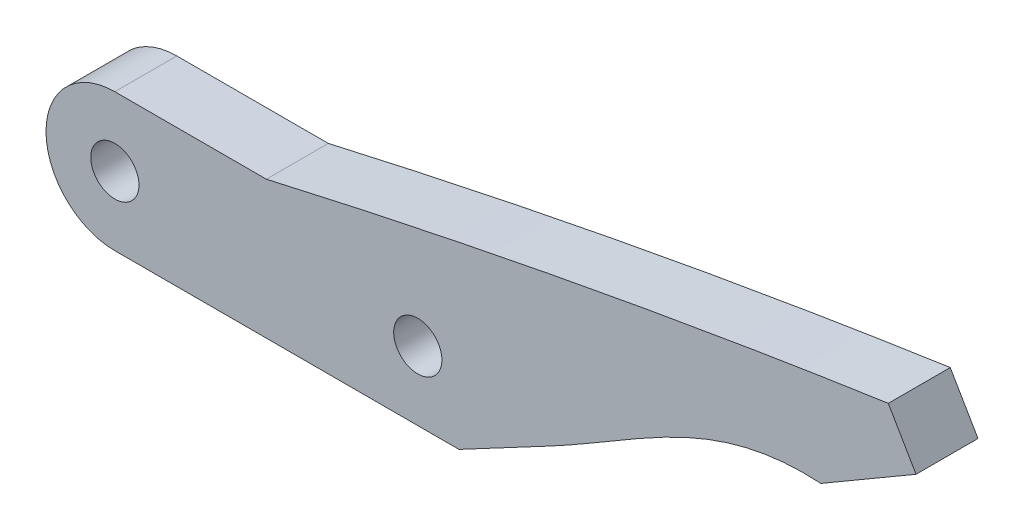
ISO-10303-21;
HEADER;
FILE_DESCRIPTION(('STEP AP214'),'2;1');
FILE_NAME('part.step','',(''),(''),'','','');
FILE_SCHEMA(('AUTOMOTIVE_DESIGN { 1 0 10303 214 1 1 1 1 }'));
ENDSEC;
DATA;
#1=APPLICATION_CONTEXT('core data for automotive mechanical design processes');
#2=APPLICATION_PROTOCOL_DEFINITION('international standard','automotive_design',2000,#1);
#3=PRODUCT_CONTEXT('',#1,'mechanical');
#4=PRODUCT('Part','Part','',(#3));
#5=PRODUCT_RELATED_PRODUCT_CATEGORY('part','',(#4));
#6=PRODUCT_DEFINITION_FORMATION('','',#4);
#7=PRODUCT_DEFINITION_CONTEXT('part definition',#1,'design');
#8=PRODUCT_DEFINITION('design','',#6,#7);
#9=PRODUCT_DEFINITION_SHAPE('','',#8);
#10=(LENGTH_UNIT() NAMED_UNIT(*) SI_UNIT(.MILLI.,.METRE.));
#11=(NAMED_UNIT(*) PLANE_ANGLE_UNIT() SI_UNIT($,.RADIAN.));
#12=(NAMED_UNIT(*) SI_UNIT($,.STERADIAN.) SOLID_ANGLE_UNIT());
#13=UNCERTAINTY_MEASURE_WITH_UNIT(LENGTH_MEASURE(1.E-05),#10,'distance_accuracy_value','');
#14=(GEOMETRIC_REPRESENTATION_CONTEXT(3) GLOBAL_UNCERTAINTY_ASSIGNED_CONTEXT((#13)) GLOBAL_UNIT_ASSIGNED_CONTEXT((#10,
#11,#12)) REPRESENTATION_CONTEXT('',''));
#15=CARTESIAN_POINT('',(0.,0.,0.));
#16=DIRECTION('',(0.,0.,1.));
#17=DIRECTION('',(1.,0.,0.));
#18=AXIS2_PLACEMENT_3D('',#15,#16,#17);
#19=CARTESIAN_POINT('',(0.,5.,4.5));
#20=DIRECTION('',(0.,1.,0.));
#21=DIRECTION('',(0.,0.,1.));
#22=AXIS2_PLACEMENT_3D('',#19,#20,#21);
#23=PLANE('',#22);
#24=DIRECTION('',(1.,0.,0.));
#25=VECTOR('',#24,1.);
#26=CARTESIAN_POINT('',(0.,5.,4.5));
#27=LINE('',#26,#25);
#28=CARTESIAN_POINT('',(-11.,5.,4.5));
#29=VERTEX_POINT('',#28);
#30=CARTESIAN_POINT('',(0.,5.,4.5));
#31=VERTEX_POINT('',#30);
#32=EDGE_CURVE('E117',#29,#31,#27,.T.);
#33=ORIENTED_EDGE('',*,*,#32,.T.);
#34=DIRECTION('',(0.,0.,1.));
#35=VECTOR('',#34,1.);
#36=CARTESIAN_POINT('',(0.,5.,-50.6741195437817));
#37=LINE('',#36,#35);
#38=CARTESIAN_POINT('',(0.,5.,0.));
#39=VERTEX_POINT('',#38);
#40=EDGE_CURVE('E101',#39,#31,#37,.T.);
#41=ORIENTED_EDGE('',*,*,#40,.F.);
#42=DIRECTION('',(1.,0.,0.));
#43=VECTOR('',#42,1.);
#44=CARTESIAN_POINT('',(0.,5.,0.));
#45=LINE('',#44,#43);
#46=CARTESIAN_POINT('',(-11.,5.,0.));
#47=VERTEX_POINT('',#46);
#48=EDGE_CURVE('E136',#47,#39,#45,.T.);
#49=ORIENTED_EDGE('',*,*,#48,.F.);
#50=DIRECTION('',(0.,0.,-1.));
#51=VECTOR('',#50,1.);
#52=CARTESIAN_POINT('',(-11.,5.,4.5));
#53=LINE('',#52,#51);
#54=EDGE_CURVE('E11',#29,#47,#53,.T.);
#55=ORIENTED_EDGE('',*,*,#54,.F.);
#56=EDGE_LOOP('',(#33,#41,#49,#55));
#57=FACE_BOUND('',#56,.T.);
#58=ADVANCED_FACE('F34',(#57),#23,.T.);
#59=CARTESIAN_POINT('',(0.,-5.,4.5));
#60=DIRECTION('',(0.,1.,0.));
#61=DIRECTION('',(0.,0.,1.));
#62=AXIS2_PLACEMENT_3D('',#59,#60,#61);
#63=PLANE('',#62);
#64=DIRECTION('',(1.,0.,0.));
#65=VECTOR('',#64,1.);
#66=CARTESIAN_POINT('',(0.,-5.,0.));
#67=LINE('',#66,#65);
#68=CARTESIAN_POINT('',(-11.,-5.,0.));
#69=VERTEX_POINT('',#68);
#70=CARTESIAN_POINT('',(13.99,-5.,0.));
#71=VERTEX_POINT('',#70);
#72=EDGE_CURVE('E134',#69,#71,#67,.T.);
#73=ORIENTED_EDGE('',*,*,#72,.T.);
#74=DIRECTION('',(0.,0.,1.));
#75=VECTOR('',#74,1.);
#76=CARTESIAN_POINT('',(13.99,-5.,-50.6741195437817));
#77=LINE('',#76,#75);
#78=CARTESIAN_POINT('',(13.99,-5.,4.5));
#79=VERTEX_POINT('',#78);
#80=EDGE_CURVE('E111',#71,#79,#77,.T.);
#81=ORIENTED_EDGE('',*,*,#80,.T.);
#82=DIRECTION('',(1.,0.,0.));
#83=VECTOR('',#82,1.);
#84=CARTESIAN_POINT('',(0.,-5.,4.5));
#85=LINE('',#84,#83);
#86=CARTESIAN_POINT('',(-11.,-5.,4.5));
#87=VERTEX_POINT('',#86);
#88=EDGE_CURVE('E122',#87,#79,#85,.T.);
#89=ORIENTED_EDGE('',*,*,#88,.F.);
#90=DIRECTION('',(0.,0.,-1.));
#91=VECTOR('',#90,1.);
#92=CARTESIAN_POINT('',(-11.,-5.,4.5));
#93=LINE('',#92,#91);
#94=EDGE_CURVE('E43',#87,#69,#93,.T.);
#95=ORIENTED_EDGE('',*,*,#94,.T.);
#96=EDGE_LOOP('',(#73,#81,#89,#95));
#97=FACE_BOUND('',#96,.T.);
#98=ADVANCED_FACE('F36',(#97),#63,.F.);
#99=CARTESIAN_POINT('',(-11.,0.,4.5));
#100=DIRECTION('',(0.,0.,-1.));
#101=DIRECTION('',(-1.,0.,0.));
#102=AXIS2_PLACEMENT_3D('',#99,#100,#101);
#103=CYLINDRICAL_SURFACE('',#102,1.75);
#104=CARTESIAN_POINT('',(-11.,0.,4.5));
#105=DIRECTION('',(0.,0.,1.));
#106=DIRECTION('',(1.,0.,0.));
#107=AXIS2_PLACEMENT_3D('',#104,#105,#106);
#108=CIRCLE('',#107,1.75);
#109=CARTESIAN_POINT('',(-9.25,0.,4.5));
#110=VERTEX_POINT('',#109);
#111=EDGE_CURVE('E124',#110,#110,#108,.T.);
#112=ORIENTED_EDGE('',*,*,#111,.T.);
#113=EDGE_LOOP('',(#112));
#114=FACE_BOUND('',#113,.T.);
#115=CARTESIAN_POINT('',(-11.,0.,0.));
#116=DIRECTION('',(0.,0.,1.));
#117=DIRECTION('',(1.,0.,0.));
#118=AXIS2_PLACEMENT_3D('',#115,#116,#117);
#119=CIRCLE('',#118,1.75);
#120=CARTESIAN_POINT('',(-9.25,0.,0.));
#121=VERTEX_POINT('',#120);
#122=EDGE_CURVE('E140',#121,#121,#119,.T.);
#123=ORIENTED_EDGE('',*,*,#122,.F.);
#124=EDGE_LOOP('',(#123));
#125=FACE_BOUND('',#124,.T.);
#126=ADVANCED_FACE('F224',(#114,#125),#103,.F.);
#127=CARTESIAN_POINT('',(-11.,0.,4.5));
#128=DIRECTION('',(0.,0.,-1.));
#129=DIRECTION('',(-1.,0.,0.));
#130=AXIS2_PLACEMENT_3D('',#127,#128,#129);
#131=CYLINDRICAL_SURFACE('',#130,5.);
#132=CARTESIAN_POINT('',(-11.,0.,0.));
#133=DIRECTION('',(0.,0.,1.));
#134=DIRECTION('',(1.,0.,0.));
#135=AXIS2_PLACEMENT_3D('',#132,#133,#134);
#136=CIRCLE('',#135,5.);
#137=EDGE_CURVE('E138',#47,#69,#136,.T.);
#138=ORIENTED_EDGE('',*,*,#137,.T.);
#139=ORIENTED_EDGE('',*,*,#94,.F.);
#140=CARTESIAN_POINT('',(-11.,0.,4.5));
#141=DIRECTION('',(0.,0.,1.));
#142=DIRECTION('',(1.,0.,0.));
#143=AXIS2_PLACEMENT_3D('',#140,#141,#142);
#144=CIRCLE('',#143,5.);
#145=EDGE_CURVE('E51',#29,#87,#144,.T.);
#146=ORIENTED_EDGE('',*,*,#145,.F.);
#147=ORIENTED_EDGE('',*,*,#54,.T.);
#148=EDGE_LOOP('',(#138,#139,#146,#147));
#149=FACE_BOUND('',#148,.T.);
#150=ADVANCED_FACE('F222',(#149),#131,.T.);
#151=CARTESIAN_POINT('',(11.,0.,4.5));
#152=DIRECTION('',(0.,0.,-1.));
#153=DIRECTION('',(-1.,0.,0.));
#154=AXIS2_PLACEMENT_3D('',#151,#152,#153);
#155=CYLINDRICAL_SURFACE('',#154,1.75);
#156=CARTESIAN_POINT('',(11.,0.,4.5));
#157=DIRECTION('',(0.,0.,1.));
#158=DIRECTION('',(1.,0.,0.));
#159=AXIS2_PLACEMENT_3D('',#156,#157,#158);
#160=CIRCLE('',#159,1.75);
#161=CARTESIAN_POINT('',(12.75,0.,4.5));
#162=VERTEX_POINT('',#161);
#163=EDGE_CURVE('E131',#162,#162,#160,.F.);
#164=ORIENTED_EDGE('',*,*,#163,.F.);
#165=EDGE_LOOP('',(#164));
#166=FACE_BOUND('',#165,.T.);
#167=CARTESIAN_POINT('',(11.,0.,0.));
#168=DIRECTION('',(0.,0.,1.));
#169=DIRECTION('',(1.,0.,0.));
#170=AXIS2_PLACEMENT_3D('',#167,#168,#169);
#171=CIRCLE('',#170,1.75);
#172=CARTESIAN_POINT('',(12.75,0.,0.));
#173=VERTEX_POINT('',#172);
#174=EDGE_CURVE('E126',#173,#173,#171,.F.);
#175=ORIENTED_EDGE('',*,*,#174,.T.);
#176=EDGE_LOOP('',(#175));
#177=FACE_BOUND('',#176,.T.);
#178=ADVANCED_FACE('F217',(#166,#177),#155,.F.);
#179=CARTESIAN_POINT('',(0.,0.,4.5));
#180=DIRECTION('',(0.,0.,1.));
#181=DIRECTION('',(1.,0.,0.));
#182=AXIS2_PLACEMENT_3D('',#179,#180,#181);
#183=PLANE('',#182);
#184=CARTESIAN_POINT('',(0.,5.,4.5));
#185=CARTESIAN_POINT('',(22.4156182427162,10.1456443198198,4.5));
#186=CARTESIAN_POINT('',(45.1671624571134,13.4853979510326,4.5));
#187=B_SPLINE_CURVE_WITH_KNOTS('',2,(#184,#185,#186),.UNSPECIFIED.,.F.,.F.,(3,3),(0.,1.),.UNSPECIFIED.);
#188=CARTESIAN_POINT('',(45.1671624571134,13.4853979510326,4.5));
#189=VERTEX_POINT('',#188);
#190=EDGE_CURVE('E105',#31,#189,#187,.T.);
#191=ORIENTED_EDGE('',*,*,#190,.F.);
#192=ORIENTED_EDGE('',*,*,#32,.F.);
#193=ORIENTED_EDGE('',*,*,#145,.T.);
#194=ORIENTED_EDGE('',*,*,#88,.T.);
#195=DIRECTION('',(-0.882942972945771,-0.469480251475697,0.));
#196=VECTOR('',#195,1.);
#197=CARTESIAN_POINT('',(5.15618121918072,-9.69713627016373,4.5));
#198=LINE('',#197,#196);
#199=CARTESIAN_POINT('',(20.61,-1.48,4.5));
#200=VERTEX_POINT('',#199);
#201=EDGE_CURVE('E120',#200,#79,#198,.T.);
#202=ORIENTED_EDGE('',*,*,#201,.F.);
#203=CARTESIAN_POINT('',(40.2713665550483,6.,4.5));
#204=CARTESIAN_POINT('',(32.4192930162658,6.48773019988266,4.5));
#205=CARTESIAN_POINT('',(27.1719478382552,2.00913238529582,4.5));
#206=CARTESIAN_POINT('',(20.61,-1.48,4.5));
#207=B_SPLINE_CURVE_WITH_KNOTS('',3,(#203,#204,#205,#206),.UNSPECIFIED.,.F.,.F.,(4,4),(0.,1.),.UNSPECIFIED.);
#208=CARTESIAN_POINT('',(40.2713665550483,6.,4.5));
#209=VERTEX_POINT('',#208);
#210=EDGE_CURVE('E177',#209,#200,#207,.T.);
#211=ORIENTED_EDGE('',*,*,#210,.F.);
#212=DIRECTION('',(-0.863849487758139,-0.50375,0.));
#213=VECTOR('',#212,1.);
#214=CARTESIAN_POINT('',(7.60844050268672,-13.0472405575865,4.5));
#215=LINE('',#214,#213);
#216=CARTESIAN_POINT('',(47.1821624571134,10.03,4.5));
#217=VERTEX_POINT('',#216);
#218=EDGE_CURVE('E174',#217,#209,#215,.T.);
#219=ORIENTED_EDGE('',*,*,#218,.F.);
#220=DIRECTION('',(0.503750000000001,-0.863849487758139,0.));
#221=VECTOR('',#220,1.);
#222=CARTESIAN_POINT('',(39.5737219544267,23.0772405575865,4.5));
#223=LINE('',#222,#221);
#224=EDGE_CURVE('E112',#189,#217,#223,.T.);
#225=ORIENTED_EDGE('',*,*,#224,.F.);
#226=EDGE_LOOP('',(#191,#192,#193,#194,#202,#211,#219,#225));
#227=FACE_BOUND('',#226,.T.);
#228=ORIENTED_EDGE('',*,*,#111,.F.);
#229=EDGE_LOOP('',(#228));
#230=FACE_BOUND('',#229,.T.);
#231=ORIENTED_EDGE('',*,*,#163,.T.);
#232=EDGE_LOOP('',(#231));
#233=FACE_BOUND('',#232,.T.);
#234=ADVANCED_FACE('F115',(#227,#230,#233),#183,.T.);
#235=CARTESIAN_POINT('',(0.,0.,0.));
#236=DIRECTION('',(0.,0.,1.));
#237=DIRECTION('',(1.,0.,0.));
#238=AXIS2_PLACEMENT_3D('',#235,#236,#237);
#239=PLANE('',#238);
#240=ORIENTED_EDGE('',*,*,#72,.F.);
#241=ORIENTED_EDGE('',*,*,#137,.F.);
#242=ORIENTED_EDGE('',*,*,#48,.T.);
#243=CARTESIAN_POINT('',(0.,5.,0.));
#244=CARTESIAN_POINT('',(22.4156182427162,10.1456443198198,0.));
#245=CARTESIAN_POINT('',(45.1671624571134,13.4853979510326,0.));
#246=B_SPLINE_CURVE_WITH_KNOTS('',2,(#243,#244,#245),.UNSPECIFIED.,.F.,.F.,(3,3),(0.,1.),.UNSPECIFIED.);
#247=CARTESIAN_POINT('',(45.1671624571134,13.4853979510326,0.));
#248=VERTEX_POINT('',#247);
#249=EDGE_CURVE('E106',#248,#39,#246,.F.);
#250=ORIENTED_EDGE('',*,*,#249,.F.);
#251=DIRECTION('',(-0.503750000000001,0.863849487758139,0.));
#252=VECTOR('',#251,1.);
#253=CARTESIAN_POINT('',(39.5737219544267,23.0772405575865,0.));
#254=LINE('',#253,#252);
#255=CARTESIAN_POINT('',(47.1821624571134,10.03,0.));
#256=VERTEX_POINT('',#255);
#257=EDGE_CURVE('E67',#256,#248,#254,.T.);
#258=ORIENTED_EDGE('',*,*,#257,.F.);
#259=DIRECTION('',(0.86384948775814,0.50375,0.));
#260=VECTOR('',#259,1.);
#261=CARTESIAN_POINT('',(7.60844050268672,-13.0472405575865,0.));
#262=LINE('',#261,#260);
#263=CARTESIAN_POINT('',(40.2713665550483,6.,0.));
#264=VERTEX_POINT('',#263);
#265=EDGE_CURVE('E336',#264,#256,#262,.T.);
#266=ORIENTED_EDGE('',*,*,#265,.F.);
#267=CARTESIAN_POINT('',(40.2713665550483,6.,0.));
#268=CARTESIAN_POINT('',(32.4192930162658,6.48773019988266,0.));
#269=CARTESIAN_POINT('',(27.1719478382552,2.00913238529582,0.));
#270=CARTESIAN_POINT('',(20.61,-1.48,0.));
#271=B_SPLINE_CURVE_WITH_KNOTS('',3,(#267,#268,#269,#270),.UNSPECIFIED.,.F.,.F.,(4,4),(0.,1.),.UNSPECIFIED.);
#272=CARTESIAN_POINT('',(20.61,-1.48,0.));
#273=VERTEX_POINT('',#272);
#274=EDGE_CURVE('E156',#273,#264,#271,.F.);
#275=ORIENTED_EDGE('',*,*,#274,.F.);
#276=DIRECTION('',(0.882942972945771,0.469480251475697,0.));
#277=VECTOR('',#276,1.);
#278=CARTESIAN_POINT('',(5.15618121918072,-9.69713627016373,0.));
#279=LINE('',#278,#277);
#280=EDGE_CURVE('E153',#71,#273,#279,.T.);
#281=ORIENTED_EDGE('',*,*,#280,.F.);
#282=EDGE_LOOP('',(#240,#241,#242,#250,#258,#266,#275,#281));
#283=FACE_BOUND('',#282,.T.);
#284=ORIENTED_EDGE('',*,*,#122,.T.);
#285=EDGE_LOOP('',(#284));
#286=FACE_BOUND('',#285,.T.);
#287=ORIENTED_EDGE('',*,*,#174,.F.);
#288=EDGE_LOOP('',(#287));
#289=FACE_BOUND('',#288,.T.);
#290=ADVANCED_FACE('F150',(#283,#286,#289),#239,.F.);
#291=CARTESIAN_POINT('',(5.15618121918072,-9.69713627016373,-50.6741195437817));
#292=DIRECTION('',(-0.469480251475697,0.882942972945771,0.));
#293=DIRECTION('',(-0.882942972945771,-0.469480251475697,0.));
#294=AXIS2_PLACEMENT_3D('',#291,#292,#293);
#295=PLANE('',#294);
#296=ORIENTED_EDGE('',*,*,#80,.F.);
#297=ORIENTED_EDGE('',*,*,#280,.T.);
#298=DIRECTION('',(0.,0.,1.));
#299=VECTOR('',#298,1.);
#300=CARTESIAN_POINT('',(20.61,-1.48,-50.6741195437817));
#301=LINE('',#300,#299);
#302=EDGE_CURVE('E164',#273,#200,#301,.T.);
#303=ORIENTED_EDGE('',*,*,#302,.T.);
#304=ORIENTED_EDGE('',*,*,#201,.T.);
#305=EDGE_LOOP('',(#296,#297,#303,#304));
#306=FACE_BOUND('',#305,.T.);
#307=ADVANCED_FACE('F162',(#306),#295,.F.);
#308=CARTESIAN_POINT('',(40.2713665550483,6.,-50.6741195437817));
#309=CARTESIAN_POINT('',(32.4192930162658,6.48773019988266,-50.6741195437817));
#310=CARTESIAN_POINT('',(27.1719478382552,2.00913238529582,-50.6741195437817));
#311=CARTESIAN_POINT('',(20.61,-1.48,-50.6741195437817));
#312=B_SPLINE_CURVE_WITH_KNOTS('',3,(#308,#309,#310,#311),.UNSPECIFIED.,.F.,.F.,(4,4),(0.,1.),.UNSPECIFIED.);
#313=DIRECTION('',(0.,0.,1.));
#314=VECTOR('',#313,1.);
#315=SURFACE_OF_LINEAR_EXTRUSION('',#312,#314);
#316=ORIENTED_EDGE('',*,*,#302,.F.);
#317=ORIENTED_EDGE('',*,*,#274,.T.);
#318=DIRECTION('',(0.,0.,1.));
#319=VECTOR('',#318,1.);
#320=CARTESIAN_POINT('',(40.2713665550483,6.,-50.6741195437817));
#321=LINE('',#320,#319);
#322=EDGE_CURVE('E166',#264,#209,#321,.T.);
#323=ORIENTED_EDGE('',*,*,#322,.T.);
#324=ORIENTED_EDGE('',*,*,#210,.T.);
#325=EDGE_LOOP('',(#316,#317,#323,#324));
#326=FACE_BOUND('',#325,.T.);
#327=ADVANCED_FACE('F203',(#326),#315,.F.);
#328=CARTESIAN_POINT('',(7.60844050268672,-13.0472405575865,-50.6741195437817));
#329=DIRECTION('',(-0.50375,0.863849487758139,0.));
#330=DIRECTION('',(-0.86384948775814,-0.50375,0.));
#331=AXIS2_PLACEMENT_3D('',#328,#329,#330);
#332=PLANE('',#331);
#333=ORIENTED_EDGE('',*,*,#322,.F.);
#334=ORIENTED_EDGE('',*,*,#265,.T.);
#335=DIRECTION('',(0.,0.,1.));
#336=VECTOR('',#335,1.);
#337=CARTESIAN_POINT('',(47.1821624571134,10.03,-50.6741195437817));
#338=LINE('',#337,#336);
#339=EDGE_CURVE('E170',#256,#217,#338,.T.);
#340=ORIENTED_EDGE('',*,*,#339,.T.);
#341=ORIENTED_EDGE('',*,*,#218,.T.);
#342=EDGE_LOOP('',(#333,#334,#340,#341));
#343=FACE_BOUND('',#342,.T.);
#344=ADVANCED_FACE('F207',(#343),#332,.F.);
#345=CARTESIAN_POINT('',(39.5737219544267,23.0772405575865,-50.6741195437817));
#346=DIRECTION('',(-0.863849487758139,-0.503750000000001,0.));
#347=DIRECTION('',(0.503750000000001,-0.863849487758139,0.));
#348=AXIS2_PLACEMENT_3D('',#345,#346,#347);
#349=PLANE('',#348);
#350=ORIENTED_EDGE('',*,*,#339,.F.);
#351=ORIENTED_EDGE('',*,*,#257,.T.);
#352=DIRECTION('',(0.,0.,1.));
#353=VECTOR('',#352,1.);
#354=CARTESIAN_POINT('',(45.1671624571134,13.4853979510326,-50.6741195437817));
#355=LINE('',#354,#353);
#356=EDGE_CURVE('E159',#248,#189,#355,.T.);
#357=ORIENTED_EDGE('',*,*,#356,.T.);
#358=ORIENTED_EDGE('',*,*,#224,.T.);
#359=EDGE_LOOP('',(#350,#351,#357,#358));
#360=FACE_BOUND('',#359,.T.);
#361=ADVANCED_FACE('F214',(#360),#349,.F.);
#362=CARTESIAN_POINT('',(0.,5.,-50.6741195437817));
#363=CARTESIAN_POINT('',(22.4156182427162,10.1456443198198,-50.6741195437817));
#364=CARTESIAN_POINT('',(45.1671624571134,13.4853979510326,-50.6741195437817));
#365=B_SPLINE_CURVE_WITH_KNOTS('',2,(#362,#363,#364),.UNSPECIFIED.,.F.,.F.,(3,3),(0.,1.),.UNSPECIFIED.);
#366=DIRECTION('',(0.,0.,1.));
#367=VECTOR('',#366,1.);
#368=SURFACE_OF_LINEAR_EXTRUSION('',#365,#367);
#369=ORIENTED_EDGE('',*,*,#356,.F.);
#370=ORIENTED_EDGE('',*,*,#249,.T.);
#371=ORIENTED_EDGE('',*,*,#40,.T.);
#372=ORIENTED_EDGE('',*,*,#190,.T.);
#373=EDGE_LOOP('',(#369,#370,#371,#372));
#374=FACE_BOUND('',#373,.T.);
#375=ADVANCED_FACE('F104',(#374),#368,.F.);
#376=CLOSED_SHELL('',(#58,#98,#126,#150,#178,#234,#290,#307,#327,#344,#361,#375));
#377=MANIFOLD_SOLID_BREP('B2',#376);
#378=ADVANCED_BREP_SHAPE_REPRESENTATION('',(#18,#377),#14);
#379=SHAPE_DEFINITION_REPRESENTATION(#9,#378);
ENDSEC;
END-ISO-10303-21;
